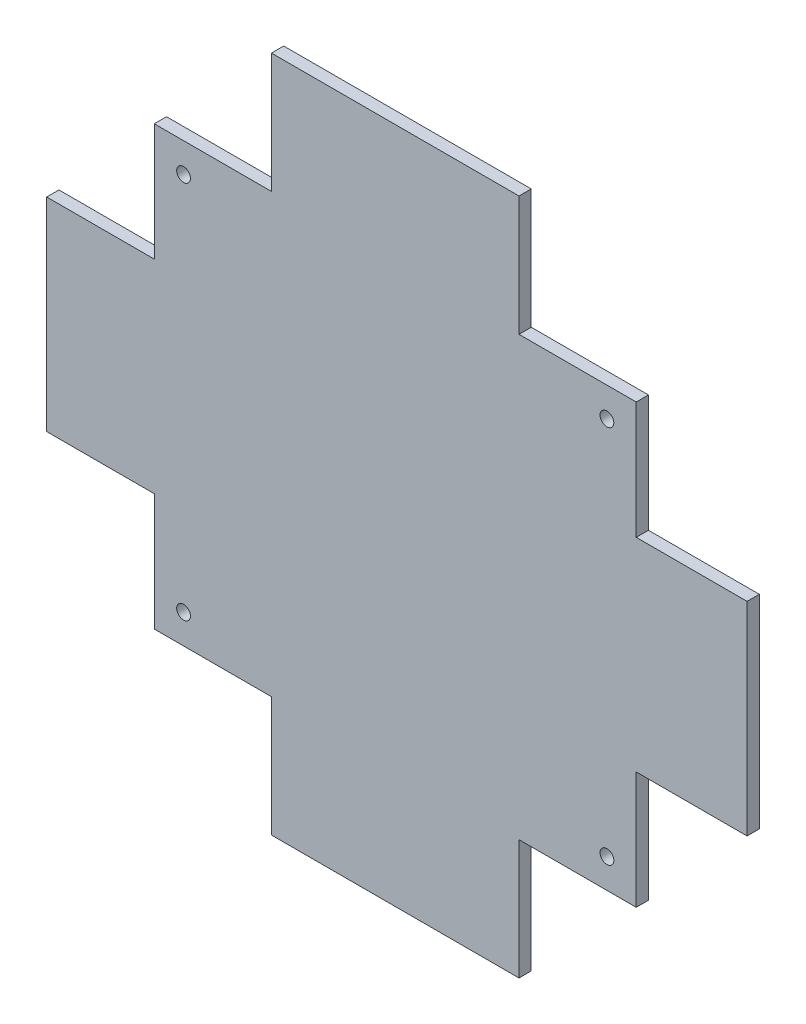
ISO-10303-21;
HEADER;
FILE_DESCRIPTION(('STEP AP214'),'2;1');
FILE_NAME('part.step','',(''),(''),'','','');
FILE_SCHEMA(('AUTOMOTIVE_DESIGN { 1 0 10303 214 1 1 1 1 }'));
ENDSEC;
DATA;
#1=APPLICATION_CONTEXT('core data for automotive mechanical design processes');
#2=APPLICATION_PROTOCOL_DEFINITION('international standard','automotive_design',2000,#1);
#3=PRODUCT_CONTEXT('',#1,'mechanical');
#4=PRODUCT('Part','Part','',(#3));
#5=PRODUCT_RELATED_PRODUCT_CATEGORY('part','',(#4));
#6=PRODUCT_DEFINITION_FORMATION('','',#4);
#7=PRODUCT_DEFINITION_CONTEXT('part definition',#1,'design');
#8=PRODUCT_DEFINITION('design','',#6,#7);
#9=PRODUCT_DEFINITION_SHAPE('','',#8);
#10=(LENGTH_UNIT() NAMED_UNIT(*) SI_UNIT(.MILLI.,.METRE.));
#11=(NAMED_UNIT(*) PLANE_ANGLE_UNIT() SI_UNIT($,.RADIAN.));
#12=(NAMED_UNIT(*) SI_UNIT($,.STERADIAN.) SOLID_ANGLE_UNIT());
#13=UNCERTAINTY_MEASURE_WITH_UNIT(LENGTH_MEASURE(1.E-05),#10,'distance_accuracy_value','');
#14=(GEOMETRIC_REPRESENTATION_CONTEXT(3) GLOBAL_UNCERTAINTY_ASSIGNED_CONTEXT((#13)) GLOBAL_UNIT_ASSIGNED_CONTEXT((#10,
#11,#12)) REPRESENTATION_CONTEXT('',''));
#15=CARTESIAN_POINT('',(0.,0.,0.));
#16=DIRECTION('',(0.,0.,1.));
#17=DIRECTION('',(1.,0.,0.));
#18=AXIS2_PLACEMENT_3D('',#15,#16,#17);
#19=CARTESIAN_POINT('',(55.7999999999952,52.7,6.35));
#20=DIRECTION('',(1.,0.,0.));
#21=DIRECTION('',(0.,1.,0.));
#22=AXIS2_PLACEMENT_3D('',#19,#20,#21);
#23=PLANE('',#22);
#24=DIRECTION('',(0.,-1.,0.));
#25=VECTOR('',#24,1.);
#26=CARTESIAN_POINT('',(55.7999999999952,52.7,0.));
#27=LINE('',#26,#25);
#28=CARTESIAN_POINT('',(55.7999999999952,113.5,0.));
#29=VERTEX_POINT('',#28);
#30=CARTESIAN_POINT('',(55.7999999999952,52.7,0.));
#31=VERTEX_POINT('',#30);
#32=EDGE_CURVE('E193',#29,#31,#27,.T.);
#33=ORIENTED_EDGE('',*,*,#32,.T.);
#34=DIRECTION('',(0.,0.,-1.));
#35=VECTOR('',#34,1.);
#36=CARTESIAN_POINT('',(55.7999999999952,52.7,6.35));
#37=LINE('',#36,#35);
#38=CARTESIAN_POINT('',(55.7999999999952,52.7,6.35));
#39=VERTEX_POINT('',#38);
#40=EDGE_CURVE('E11',#39,#31,#37,.T.);
#41=ORIENTED_EDGE('',*,*,#40,.F.);
#42=DIRECTION('',(0.,-1.,0.));
#43=VECTOR('',#42,1.);
#44=CARTESIAN_POINT('',(55.7999999999952,52.7,6.35));
#45=LINE('',#44,#43);
#46=CARTESIAN_POINT('',(55.7999999999952,113.5,6.35));
#47=VERTEX_POINT('',#46);
#48=EDGE_CURVE('E231',#47,#39,#45,.T.);
#49=ORIENTED_EDGE('',*,*,#48,.F.);
#50=DIRECTION('',(0.,0.,-1.));
#51=VECTOR('',#50,1.);
#52=CARTESIAN_POINT('',(55.7999999999952,113.5,6.35));
#53=LINE('',#52,#51);
#54=EDGE_CURVE('E189',#47,#29,#53,.T.);
#55=ORIENTED_EDGE('',*,*,#54,.T.);
#56=EDGE_LOOP('',(#33,#41,#49,#55));
#57=FACE_BOUND('',#56,.T.);
#58=ADVANCED_FACE('F33',(#57),#23,.F.);
#59=CARTESIAN_POINT('',(0.,52.7,6.35));
#60=DIRECTION('',(0.,-1.,0.));
#61=DIRECTION('',(1.,0.,0.));
#62=AXIS2_PLACEMENT_3D('',#59,#60,#61);
#63=PLANE('',#62);
#64=DIRECTION('',(-1.,0.,0.));
#65=VECTOR('',#64,1.);
#66=CARTESIAN_POINT('',(0.,52.7,0.));
#67=LINE('',#66,#65);
#68=CARTESIAN_POINT('',(0.,52.7,0.));
#69=VERTEX_POINT('',#68);
#70=EDGE_CURVE('E196',#31,#69,#67,.T.);
#71=ORIENTED_EDGE('',*,*,#70,.T.);
#72=DIRECTION('',(0.,0.,-1.));
#73=VECTOR('',#72,1.);
#74=CARTESIAN_POINT('',(0.,52.7,6.35));
#75=LINE('',#74,#73);
#76=CARTESIAN_POINT('',(0.,52.7,6.35));
#77=VERTEX_POINT('',#76);
#78=EDGE_CURVE('E41',#77,#69,#75,.T.);
#79=ORIENTED_EDGE('',*,*,#78,.F.);
#80=DIRECTION('',(-1.,0.,0.));
#81=VECTOR('',#80,1.);
#82=CARTESIAN_POINT('',(0.,52.7,6.35));
#83=LINE('',#82,#81);
#84=EDGE_CURVE('E123',#39,#77,#83,.T.);
#85=ORIENTED_EDGE('',*,*,#84,.F.);
#86=ORIENTED_EDGE('',*,*,#40,.T.);
#87=EDGE_LOOP('',(#71,#79,#85,#86));
#88=FACE_BOUND('',#87,.T.);
#89=ADVANCED_FACE('F344',(#88),#63,.F.);
#90=CARTESIAN_POINT('',(0.,-52.7,6.35));
#91=DIRECTION('',(1.,0.,0.));
#92=DIRECTION('',(0.,0.,-1.));
#93=AXIS2_PLACEMENT_3D('',#90,#91,#92);
#94=PLANE('',#93);
#95=DIRECTION('',(0.,-1.,0.));
#96=VECTOR('',#95,1.);
#97=CARTESIAN_POINT('',(0.,-52.7,0.));
#98=LINE('',#97,#96);
#99=CARTESIAN_POINT('',(0.,-52.7,0.));
#100=VERTEX_POINT('',#99);
#101=EDGE_CURVE('E199',#69,#100,#98,.T.);
#102=ORIENTED_EDGE('',*,*,#101,.T.);
#103=DIRECTION('',(0.,0.,-1.));
#104=VECTOR('',#103,1.);
#105=CARTESIAN_POINT('',(0.,-52.7,6.35));
#106=LINE('',#105,#104);
#107=CARTESIAN_POINT('',(0.,-52.7,6.35));
#108=VERTEX_POINT('',#107);
#109=EDGE_CURVE('E268',#108,#100,#106,.T.);
#110=ORIENTED_EDGE('',*,*,#109,.F.);
#111=DIRECTION('',(0.,-1.,0.));
#112=VECTOR('',#111,1.);
#113=CARTESIAN_POINT('',(0.,-52.7,6.35));
#114=LINE('',#113,#112);
#115=EDGE_CURVE('E276',#77,#108,#114,.T.);
#116=ORIENTED_EDGE('',*,*,#115,.F.);
#117=ORIENTED_EDGE('',*,*,#78,.T.);
#118=EDGE_LOOP('',(#102,#110,#116,#117));
#119=FACE_BOUND('',#118,.T.);
#120=ADVANCED_FACE('F274',(#119),#94,.F.);
#121=CARTESIAN_POINT('',(55.7999999999952,-52.7,6.35));
#122=DIRECTION('',(0.,1.,0.));
#123=DIRECTION('',(-1.,0.,0.));
#124=AXIS2_PLACEMENT_3D('',#121,#122,#123);
#125=PLANE('',#124);
#126=DIRECTION('',(1.,0.,0.));
#127=VECTOR('',#126,1.);
#128=CARTESIAN_POINT('',(55.7999999999952,-52.7,0.));
#129=LINE('',#128,#127);
#130=CARTESIAN_POINT('',(55.7999999999952,-52.7,0.));
#131=VERTEX_POINT('',#130);
#132=EDGE_CURVE('E201',#100,#131,#129,.T.);
#133=ORIENTED_EDGE('',*,*,#132,.T.);
#134=DIRECTION('',(0.,0.,-1.));
#135=VECTOR('',#134,1.);
#136=CARTESIAN_POINT('',(55.7999999999952,-52.7,6.35));
#137=LINE('',#136,#135);
#138=CARTESIAN_POINT('',(55.7999999999952,-52.7,6.35));
#139=VERTEX_POINT('',#138);
#140=EDGE_CURVE('E265',#139,#131,#137,.T.);
#141=ORIENTED_EDGE('',*,*,#140,.F.);
#142=DIRECTION('',(1.,0.,0.));
#143=VECTOR('',#142,1.);
#144=CARTESIAN_POINT('',(55.7999999999952,-52.7,6.35));
#145=LINE('',#144,#143);
#146=EDGE_CURVE('E294',#108,#139,#145,.T.);
#147=ORIENTED_EDGE('',*,*,#146,.F.);
#148=ORIENTED_EDGE('',*,*,#109,.T.);
#149=EDGE_LOOP('',(#133,#141,#147,#148));
#150=FACE_BOUND('',#149,.T.);
#151=ADVANCED_FACE('F285',(#150),#125,.F.);
#152=CARTESIAN_POINT('',(55.7999999999952,-113.5,6.35));
#153=DIRECTION('',(1.,0.,0.));
#154=DIRECTION('',(0.,0.,-1.));
#155=AXIS2_PLACEMENT_3D('',#152,#153,#154);
#156=PLANE('',#155);
#157=DIRECTION('',(0.,-1.,0.));
#158=VECTOR('',#157,1.);
#159=CARTESIAN_POINT('',(55.7999999999952,-113.5,0.));
#160=LINE('',#159,#158);
#161=CARTESIAN_POINT('',(55.7999999999952,-113.5,0.));
#162=VERTEX_POINT('',#161);
#163=EDGE_CURVE('E203',#131,#162,#160,.T.);
#164=ORIENTED_EDGE('',*,*,#163,.T.);
#165=DIRECTION('',(0.,0.,-1.));
#166=VECTOR('',#165,1.);
#167=CARTESIAN_POINT('',(55.7999999999952,-113.5,6.35));
#168=LINE('',#167,#166);
#169=CARTESIAN_POINT('',(55.7999999999952,-113.5,6.35));
#170=VERTEX_POINT('',#169);
#171=EDGE_CURVE('E262',#170,#162,#168,.T.);
#172=ORIENTED_EDGE('',*,*,#171,.F.);
#173=DIRECTION('',(0.,-1.,0.));
#174=VECTOR('',#173,1.);
#175=CARTESIAN_POINT('',(55.7999999999952,-113.5,6.35));
#176=LINE('',#175,#174);
#177=EDGE_CURVE('E291',#139,#170,#176,.T.);
#178=ORIENTED_EDGE('',*,*,#177,.F.);
#179=ORIENTED_EDGE('',*,*,#140,.T.);
#180=EDGE_LOOP('',(#164,#172,#178,#179));
#181=FACE_BOUND('',#180,.T.);
#182=ADVANCED_FACE('F289',(#181),#156,.F.);
#183=CARTESIAN_POINT('',(116.599999999995,-113.5,6.35));
#184=DIRECTION('',(0.,1.,0.));
#185=DIRECTION('',(-1.,0.,0.));
#186=AXIS2_PLACEMENT_3D('',#183,#184,#185);
#187=PLANE('',#186);
#188=DIRECTION('',(1.,0.,0.));
#189=VECTOR('',#188,1.);
#190=CARTESIAN_POINT('',(116.599999999995,-113.5,0.));
#191=LINE('',#190,#189);
#192=CARTESIAN_POINT('',(116.599999999995,-113.5,0.));
#193=VERTEX_POINT('',#192);
#194=EDGE_CURVE('E205',#162,#193,#191,.T.);
#195=ORIENTED_EDGE('',*,*,#194,.T.);
#196=DIRECTION('',(0.,0.,-1.));
#197=VECTOR('',#196,1.);
#198=CARTESIAN_POINT('',(116.599999999995,-113.5,6.35));
#199=LINE('',#198,#197);
#200=CARTESIAN_POINT('',(116.599999999995,-113.5,6.35));
#201=VERTEX_POINT('',#200);
#202=EDGE_CURVE('E259',#201,#193,#199,.T.);
#203=ORIENTED_EDGE('',*,*,#202,.F.);
#204=DIRECTION('',(1.,0.,0.));
#205=VECTOR('',#204,1.);
#206=CARTESIAN_POINT('',(116.599999999995,-113.5,6.35));
#207=LINE('',#206,#205);
#208=EDGE_CURVE('E293',#170,#201,#207,.T.);
#209=ORIENTED_EDGE('',*,*,#208,.F.);
#210=ORIENTED_EDGE('',*,*,#171,.T.);
#211=EDGE_LOOP('',(#195,#203,#209,#210));
#212=FACE_BOUND('',#211,.T.);
#213=ADVANCED_FACE('F357',(#212),#187,.F.);
#214=CARTESIAN_POINT('',(116.599999999995,-175.649999999999,6.35));
#215=DIRECTION('',(1.,0.,0.));
#216=DIRECTION('',(0.,1.,0.));
#217=AXIS2_PLACEMENT_3D('',#214,#215,#216);
#218=PLANE('',#217);
#219=DIRECTION('',(0.,-1.,0.));
#220=VECTOR('',#219,1.);
#221=CARTESIAN_POINT('',(116.599999999995,-175.649999999999,0.));
#222=LINE('',#221,#220);
#223=CARTESIAN_POINT('',(116.599999999995,-175.649999999999,0.));
#224=VERTEX_POINT('',#223);
#225=EDGE_CURVE('E207',#193,#224,#222,.T.);
#226=ORIENTED_EDGE('',*,*,#225,.T.);
#227=DIRECTION('',(0.,0.,-1.));
#228=VECTOR('',#227,1.);
#229=CARTESIAN_POINT('',(116.599999999995,-175.649999999999,6.35));
#230=LINE('',#229,#228);
#231=CARTESIAN_POINT('',(116.599999999995,-175.649999999999,6.35));
#232=VERTEX_POINT('',#231);
#233=EDGE_CURVE('E256',#232,#224,#230,.T.);
#234=ORIENTED_EDGE('',*,*,#233,.F.);
#235=DIRECTION('',(0.,-1.,0.));
#236=VECTOR('',#235,1.);
#237=CARTESIAN_POINT('',(116.599999999995,-175.649999999999,6.35));
#238=LINE('',#237,#236);
#239=EDGE_CURVE('E296',#201,#232,#238,.T.);
#240=ORIENTED_EDGE('',*,*,#239,.F.);
#241=ORIENTED_EDGE('',*,*,#202,.T.);
#242=EDGE_LOOP('',(#226,#234,#240,#241));
#243=FACE_BOUND('',#242,.T.);
#244=ADVANCED_FACE('F360',(#243),#218,.F.);
#245=CARTESIAN_POINT('',(244.999999999997,-175.649999999999,6.35));
#246=DIRECTION('',(0.,1.,0.));
#247=DIRECTION('',(0.,0.,1.));
#248=AXIS2_PLACEMENT_3D('',#245,#246,#247);
#249=PLANE('',#248);
#250=DIRECTION('',(1.,0.,0.));
#251=VECTOR('',#250,1.);
#252=CARTESIAN_POINT('',(244.999999999997,-175.649999999999,0.));
#253=LINE('',#252,#251);
#254=CARTESIAN_POINT('',(244.999999999997,-175.649999999999,0.));
#255=VERTEX_POINT('',#254);
#256=EDGE_CURVE('E209',#224,#255,#253,.T.);
#257=ORIENTED_EDGE('',*,*,#256,.T.);
#258=DIRECTION('',(0.,0.,-1.));
#259=VECTOR('',#258,1.);
#260=CARTESIAN_POINT('',(244.999999999997,-175.649999999999,6.35));
#261=LINE('',#260,#259);
#262=CARTESIAN_POINT('',(244.999999999997,-175.649999999999,6.35));
#263=VERTEX_POINT('',#262);
#264=EDGE_CURVE('E253',#263,#255,#261,.T.);
#265=ORIENTED_EDGE('',*,*,#264,.F.);
#266=DIRECTION('',(1.,0.,0.));
#267=VECTOR('',#266,1.);
#268=CARTESIAN_POINT('',(244.999999999997,-175.649999999999,6.35));
#269=LINE('',#268,#267);
#270=EDGE_CURVE('E302',#232,#263,#269,.T.);
#271=ORIENTED_EDGE('',*,*,#270,.F.);
#272=ORIENTED_EDGE('',*,*,#233,.T.);
#273=EDGE_LOOP('',(#257,#265,#271,#272));
#274=FACE_BOUND('',#273,.T.);
#275=ADVANCED_FACE('F364',(#274),#249,.F.);
#276=CARTESIAN_POINT('',(244.999999999997,-113.5,6.35));
#277=DIRECTION('',(-1.,0.,0.));
#278=DIRECTION('',(0.,0.,1.));
#279=AXIS2_PLACEMENT_3D('',#276,#277,#278);
#280=PLANE('',#279);
#281=DIRECTION('',(0.,1.,0.));
#282=VECTOR('',#281,1.);
#283=CARTESIAN_POINT('',(244.999999999997,-113.5,0.));
#284=LINE('',#283,#282);
#285=CARTESIAN_POINT('',(244.999999999997,-113.5,0.));
#286=VERTEX_POINT('',#285);
#287=EDGE_CURVE('E211',#255,#286,#284,.T.);
#288=ORIENTED_EDGE('',*,*,#287,.T.);
#289=DIRECTION('',(0.,0.,-1.));
#290=VECTOR('',#289,1.);
#291=CARTESIAN_POINT('',(244.999999999997,-113.5,6.35));
#292=LINE('',#291,#290);
#293=CARTESIAN_POINT('',(244.999999999997,-113.5,6.35));
#294=VERTEX_POINT('',#293);
#295=EDGE_CURVE('E250',#294,#286,#292,.T.);
#296=ORIENTED_EDGE('',*,*,#295,.F.);
#297=DIRECTION('',(0.,1.,0.));
#298=VECTOR('',#297,1.);
#299=CARTESIAN_POINT('',(244.999999999997,-113.5,6.35));
#300=LINE('',#299,#298);
#301=EDGE_CURVE('E304',#263,#294,#300,.T.);
#302=ORIENTED_EDGE('',*,*,#301,.F.);
#303=ORIENTED_EDGE('',*,*,#264,.T.);
#304=EDGE_LOOP('',(#288,#296,#302,#303));
#305=FACE_BOUND('',#304,.T.);
#306=ADVANCED_FACE('F368',(#305),#280,.F.);
#307=CARTESIAN_POINT('',(305.799999999994,-113.5,6.35));
#308=DIRECTION('',(0.,1.,0.));
#309=DIRECTION('',(-1.,0.,0.));
#310=AXIS2_PLACEMENT_3D('',#307,#308,#309);
#311=PLANE('',#310);
#312=DIRECTION('',(1.,0.,0.));
#313=VECTOR('',#312,1.);
#314=CARTESIAN_POINT('',(305.799999999994,-113.5,0.));
#315=LINE('',#314,#313);
#316=CARTESIAN_POINT('',(305.799999999994,-113.5,0.));
#317=VERTEX_POINT('',#316);
#318=EDGE_CURVE('E213',#286,#317,#315,.T.);
#319=ORIENTED_EDGE('',*,*,#318,.T.);
#320=DIRECTION('',(0.,0.,-1.));
#321=VECTOR('',#320,1.);
#322=CARTESIAN_POINT('',(305.799999999994,-113.5,6.35));
#323=LINE('',#322,#321);
#324=CARTESIAN_POINT('',(305.799999999994,-113.5,6.35));
#325=VERTEX_POINT('',#324);
#326=EDGE_CURVE('E247',#325,#317,#323,.T.);
#327=ORIENTED_EDGE('',*,*,#326,.F.);
#328=DIRECTION('',(1.,0.,0.));
#329=VECTOR('',#328,1.);
#330=CARTESIAN_POINT('',(305.799999999994,-113.5,6.35));
#331=LINE('',#330,#329);
#332=EDGE_CURVE('E306',#294,#325,#331,.T.);
#333=ORIENTED_EDGE('',*,*,#332,.F.);
#334=ORIENTED_EDGE('',*,*,#295,.T.);
#335=EDGE_LOOP('',(#319,#327,#333,#334));
#336=FACE_BOUND('',#335,.T.);
#337=ADVANCED_FACE('F372',(#336),#311,.F.);
#338=CARTESIAN_POINT('',(305.799999999994,-52.6999999999999,6.35));
#339=DIRECTION('',(-1.,0.,0.));
#340=DIRECTION('',(0.,0.,1.));
#341=AXIS2_PLACEMENT_3D('',#338,#339,#340);
#342=PLANE('',#341);
#343=DIRECTION('',(0.,1.,0.));
#344=VECTOR('',#343,1.);
#345=CARTESIAN_POINT('',(305.799999999994,-52.6999999999999,0.));
#346=LINE('',#345,#344);
#347=CARTESIAN_POINT('',(305.799999999994,-52.6999999999999,0.));
#348=VERTEX_POINT('',#347);
#349=EDGE_CURVE('E215',#317,#348,#346,.T.);
#350=ORIENTED_EDGE('',*,*,#349,.T.);
#351=DIRECTION('',(0.,0.,-1.));
#352=VECTOR('',#351,1.);
#353=CARTESIAN_POINT('',(305.799999999994,-52.6999999999999,6.35));
#354=LINE('',#353,#352);
#355=CARTESIAN_POINT('',(305.799999999994,-52.6999999999999,6.35));
#356=VERTEX_POINT('',#355);
#357=EDGE_CURVE('E244',#356,#348,#354,.T.);
#358=ORIENTED_EDGE('',*,*,#357,.F.);
#359=DIRECTION('',(0.,1.,0.));
#360=VECTOR('',#359,1.);
#361=CARTESIAN_POINT('',(305.799999999994,-52.6999999999999,6.35));
#362=LINE('',#361,#360);
#363=EDGE_CURVE('E308',#325,#356,#362,.T.);
#364=ORIENTED_EDGE('',*,*,#363,.F.);
#365=ORIENTED_EDGE('',*,*,#326,.T.);
#366=EDGE_LOOP('',(#350,#358,#364,#365));
#367=FACE_BOUND('',#366,.T.);
#368=ADVANCED_FACE('F376',(#367),#342,.F.);
#369=CARTESIAN_POINT('',(362.099999999994,-52.6999999999999,6.35));
#370=DIRECTION('',(0.,1.,0.));
#371=DIRECTION('',(-1.,0.,0.));
#372=AXIS2_PLACEMENT_3D('',#369,#370,#371);
#373=PLANE('',#372);
#374=DIRECTION('',(1.,0.,0.));
#375=VECTOR('',#374,1.);
#376=CARTESIAN_POINT('',(362.099999999994,-52.6999999999999,0.));
#377=LINE('',#376,#375);
#378=CARTESIAN_POINT('',(363.299999999994,-52.7000000000001,0.));
#379=VERTEX_POINT('',#378);
#380=EDGE_CURVE('E217',#348,#379,#377,.T.);
#381=ORIENTED_EDGE('',*,*,#380,.T.);
#382=DIRECTION('',(0.,0.,1.));
#383=VECTOR('',#382,1.);
#384=CARTESIAN_POINT('',(363.299999999994,-52.7000000000001,0.));
#385=LINE('',#384,#383);
#386=CARTESIAN_POINT('',(363.299999999994,-52.7000000000001,6.35));
#387=VERTEX_POINT('',#386);
#388=EDGE_CURVE('E521',#379,#387,#385,.T.);
#389=ORIENTED_EDGE('',*,*,#388,.T.);
#390=DIRECTION('',(1.,0.,0.));
#391=VECTOR('',#390,1.);
#392=CARTESIAN_POINT('',(362.099999999994,-52.6999999999999,6.35));
#393=LINE('',#392,#391);
#394=EDGE_CURVE('E310',#356,#387,#393,.T.);
#395=ORIENTED_EDGE('',*,*,#394,.F.);
#396=ORIENTED_EDGE('',*,*,#357,.T.);
#397=EDGE_LOOP('',(#381,#389,#395,#396));
#398=FACE_BOUND('',#397,.T.);
#399=ADVANCED_FACE('F380',(#398),#373,.F.);
#400=CARTESIAN_POINT('',(305.799999999994,52.7,6.35));
#401=DIRECTION('',(0.,-1.,0.));
#402=DIRECTION('',(0.,0.,-1.));
#403=AXIS2_PLACEMENT_3D('',#400,#401,#402);
#404=PLANE('',#403);
#405=DIRECTION('',(-1.,0.,0.));
#406=VECTOR('',#405,1.);
#407=CARTESIAN_POINT('',(305.799999999994,52.7,0.));
#408=LINE('',#407,#406);
#409=CARTESIAN_POINT('',(363.299999999994,52.7,0.));
#410=VERTEX_POINT('',#409);
#411=CARTESIAN_POINT('',(305.799999999994,52.7,0.));
#412=VERTEX_POINT('',#411);
#413=EDGE_CURVE('E220',#410,#412,#408,.T.);
#414=ORIENTED_EDGE('',*,*,#413,.T.);
#415=DIRECTION('',(0.,0.,-1.));
#416=VECTOR('',#415,1.);
#417=CARTESIAN_POINT('',(305.799999999994,52.7,6.35));
#418=LINE('',#417,#416);
#419=CARTESIAN_POINT('',(305.799999999994,52.7,6.35));
#420=VERTEX_POINT('',#419);
#421=EDGE_CURVE('E241',#420,#412,#418,.T.);
#422=ORIENTED_EDGE('',*,*,#421,.F.);
#423=DIRECTION('',(-1.,0.,0.));
#424=VECTOR('',#423,1.);
#425=CARTESIAN_POINT('',(305.799999999994,52.7,6.35));
#426=LINE('',#425,#424);
#427=CARTESIAN_POINT('',(363.299999999994,52.7,6.35));
#428=VERTEX_POINT('',#427);
#429=EDGE_CURVE('E313',#428,#420,#426,.T.);
#430=ORIENTED_EDGE('',*,*,#429,.F.);
#431=DIRECTION('',(0.,0.,1.));
#432=VECTOR('',#431,1.);
#433=CARTESIAN_POINT('',(363.299999999994,52.7,0.));
#434=LINE('',#433,#432);
#435=EDGE_CURVE('E197',#410,#428,#434,.T.);
#436=ORIENTED_EDGE('',*,*,#435,.F.);
#437=EDGE_LOOP('',(#414,#422,#430,#436));
#438=FACE_BOUND('',#437,.T.);
#439=ADVANCED_FACE('F383',(#438),#404,.F.);
#440=CARTESIAN_POINT('',(305.799999999994,113.5,6.35));
#441=DIRECTION('',(-1.,0.,0.));
#442=DIRECTION('',(0.,-1.,0.));
#443=AXIS2_PLACEMENT_3D('',#440,#441,#442);
#444=PLANE('',#443);
#445=DIRECTION('',(0.,1.,0.));
#446=VECTOR('',#445,1.);
#447=CARTESIAN_POINT('',(305.799999999994,113.5,0.));
#448=LINE('',#447,#446);
#449=CARTESIAN_POINT('',(305.799999999994,113.5,0.));
#450=VERTEX_POINT('',#449);
#451=EDGE_CURVE('E222',#412,#450,#448,.T.);
#452=ORIENTED_EDGE('',*,*,#451,.T.);
#453=DIRECTION('',(0.,0.,-1.));
#454=VECTOR('',#453,1.);
#455=CARTESIAN_POINT('',(305.799999999994,113.5,6.35));
#456=LINE('',#455,#454);
#457=CARTESIAN_POINT('',(305.799999999994,113.5,6.35));
#458=VERTEX_POINT('',#457);
#459=EDGE_CURVE('E238',#458,#450,#456,.T.);
#460=ORIENTED_EDGE('',*,*,#459,.F.);
#461=DIRECTION('',(0.,1.,0.));
#462=VECTOR('',#461,1.);
#463=CARTESIAN_POINT('',(305.799999999994,113.5,6.35));
#464=LINE('',#463,#462);
#465=EDGE_CURVE('E315',#420,#458,#464,.T.);
#466=ORIENTED_EDGE('',*,*,#465,.F.);
#467=ORIENTED_EDGE('',*,*,#421,.T.);
#468=EDGE_LOOP('',(#452,#460,#466,#467));
#469=FACE_BOUND('',#468,.T.);
#470=ADVANCED_FACE('F387',(#469),#444,.F.);
#471=CARTESIAN_POINT('',(244.999999999994,113.5,6.35));
#472=DIRECTION('',(0.,-1.,0.));
#473=DIRECTION('',(0.,0.,-1.));
#474=AXIS2_PLACEMENT_3D('',#471,#472,#473);
#475=PLANE('',#474);
#476=DIRECTION('',(-1.,0.,0.));
#477=VECTOR('',#476,1.);
#478=CARTESIAN_POINT('',(244.999999999994,113.5,0.));
#479=LINE('',#478,#477);
#480=CARTESIAN_POINT('',(244.999999999994,113.5,0.));
#481=VERTEX_POINT('',#480);
#482=EDGE_CURVE('E224',#450,#481,#479,.T.);
#483=ORIENTED_EDGE('',*,*,#482,.T.);
#484=DIRECTION('',(0.,0.,-1.));
#485=VECTOR('',#484,1.);
#486=CARTESIAN_POINT('',(244.999999999994,113.5,6.35));
#487=LINE('',#486,#485);
#488=CARTESIAN_POINT('',(244.999999999994,113.5,6.35));
#489=VERTEX_POINT('',#488);
#490=EDGE_CURVE('E235',#489,#481,#487,.T.);
#491=ORIENTED_EDGE('',*,*,#490,.F.);
#492=DIRECTION('',(-1.,0.,0.));
#493=VECTOR('',#492,1.);
#494=CARTESIAN_POINT('',(244.999999999994,113.5,6.35));
#495=LINE('',#494,#493);
#496=EDGE_CURVE('E317',#458,#489,#495,.T.);
#497=ORIENTED_EDGE('',*,*,#496,.F.);
#498=ORIENTED_EDGE('',*,*,#459,.T.);
#499=EDGE_LOOP('',(#483,#491,#497,#498));
#500=FACE_BOUND('',#499,.T.);
#501=ADVANCED_FACE('F323',(#500),#475,.F.);
#502=CARTESIAN_POINT('',(244.999999999994,175.65,6.35));
#503=DIRECTION('',(-1.,0.,0.));
#504=DIRECTION('',(0.,-1.,0.));
#505=AXIS2_PLACEMENT_3D('',#502,#503,#504);
#506=PLANE('',#505);
#507=DIRECTION('',(0.,1.,0.));
#508=VECTOR('',#507,1.);
#509=CARTESIAN_POINT('',(244.999999999994,175.65,0.));
#510=LINE('',#509,#508);
#511=CARTESIAN_POINT('',(244.999999999994,175.65,0.));
#512=VERTEX_POINT('',#511);
#513=EDGE_CURVE('E226',#481,#512,#510,.T.);
#514=ORIENTED_EDGE('',*,*,#513,.T.);
#515=DIRECTION('',(0.,0.,-1.));
#516=VECTOR('',#515,1.);
#517=CARTESIAN_POINT('',(244.999999999994,175.65,6.35));
#518=LINE('',#517,#516);
#519=CARTESIAN_POINT('',(244.999999999994,175.65,6.35));
#520=VERTEX_POINT('',#519);
#521=EDGE_CURVE('E184',#520,#512,#518,.T.);
#522=ORIENTED_EDGE('',*,*,#521,.F.);
#523=DIRECTION('',(0.,1.,0.));
#524=VECTOR('',#523,1.);
#525=CARTESIAN_POINT('',(244.999999999994,175.65,6.35));
#526=LINE('',#525,#524);
#527=EDGE_CURVE('E175',#489,#520,#526,.T.);
#528=ORIENTED_EDGE('',*,*,#527,.F.);
#529=ORIENTED_EDGE('',*,*,#490,.T.);
#530=EDGE_LOOP('',(#514,#522,#528,#529));
#531=FACE_BOUND('',#530,.T.);
#532=ADVANCED_FACE('F327',(#531),#506,.F.);
#533=CARTESIAN_POINT('',(116.599999999995,175.65,6.35));
#534=DIRECTION('',(0.,-1.,0.));
#535=DIRECTION('',(0.,0.,-1.));
#536=AXIS2_PLACEMENT_3D('',#533,#534,#535);
#537=PLANE('',#536);
#538=DIRECTION('',(-1.,0.,0.));
#539=VECTOR('',#538,1.);
#540=CARTESIAN_POINT('',(116.599999999995,175.65,0.));
#541=LINE('',#540,#539);
#542=CARTESIAN_POINT('',(116.599999999995,175.65,0.));
#543=VERTEX_POINT('',#542);
#544=EDGE_CURVE('E183',#512,#543,#541,.T.);
#545=ORIENTED_EDGE('',*,*,#544,.T.);
#546=DIRECTION('',(0.,0.,-1.));
#547=VECTOR('',#546,1.);
#548=CARTESIAN_POINT('',(116.599999999995,175.65,6.35));
#549=LINE('',#548,#547);
#550=CARTESIAN_POINT('',(116.599999999995,175.65,6.35));
#551=VERTEX_POINT('',#550);
#552=EDGE_CURVE('E180',#551,#543,#549,.T.);
#553=ORIENTED_EDGE('',*,*,#552,.F.);
#554=DIRECTION('',(-1.,0.,0.));
#555=VECTOR('',#554,1.);
#556=CARTESIAN_POINT('',(116.599999999995,175.65,6.35));
#557=LINE('',#556,#555);
#558=EDGE_CURVE('E169',#520,#551,#557,.T.);
#559=ORIENTED_EDGE('',*,*,#558,.F.);
#560=ORIENTED_EDGE('',*,*,#521,.T.);
#561=EDGE_LOOP('',(#545,#553,#559,#560));
#562=FACE_BOUND('',#561,.T.);
#563=ADVANCED_FACE('F181',(#562),#537,.F.);
#564=CARTESIAN_POINT('',(116.599999999995,113.5,6.35));
#565=DIRECTION('',(1.,0.,0.));
#566=DIRECTION('',(0.,0.,-1.));
#567=AXIS2_PLACEMENT_3D('',#564,#565,#566);
#568=PLANE('',#567);
#569=DIRECTION('',(0.,-1.,0.));
#570=VECTOR('',#569,1.);
#571=CARTESIAN_POINT('',(116.599999999995,113.5,0.));
#572=LINE('',#571,#570);
#573=CARTESIAN_POINT('',(116.599999999995,113.5,0.));
#574=VERTEX_POINT('',#573);
#575=EDGE_CURVE('E109',#543,#574,#572,.T.);
#576=ORIENTED_EDGE('',*,*,#575,.T.);
#577=DIRECTION('',(0.,0.,-1.));
#578=VECTOR('',#577,1.);
#579=CARTESIAN_POINT('',(116.599999999995,113.5,6.35));
#580=LINE('',#579,#578);
#581=CARTESIAN_POINT('',(116.599999999995,113.5,6.35));
#582=VERTEX_POINT('',#581);
#583=EDGE_CURVE('E185',#582,#574,#580,.T.);
#584=ORIENTED_EDGE('',*,*,#583,.F.);
#585=DIRECTION('',(0.,-1.,0.));
#586=VECTOR('',#585,1.);
#587=CARTESIAN_POINT('',(116.599999999995,113.5,6.35));
#588=LINE('',#587,#586);
#589=EDGE_CURVE('E173',#551,#582,#588,.T.);
#590=ORIENTED_EDGE('',*,*,#589,.F.);
#591=ORIENTED_EDGE('',*,*,#552,.T.);
#592=EDGE_LOOP('',(#576,#584,#590,#591));
#593=FACE_BOUND('',#592,.T.);
#594=ADVANCED_FACE('F187',(#593),#568,.F.);
#595=CARTESIAN_POINT('',(55.7999999999952,113.5,6.35));
#596=DIRECTION('',(0.,-1.,0.));
#597=DIRECTION('',(0.,0.,-1.));
#598=AXIS2_PLACEMENT_3D('',#595,#596,#597);
#599=PLANE('',#598);
#600=DIRECTION('',(-1.,0.,0.));
#601=VECTOR('',#600,1.);
#602=CARTESIAN_POINT('',(55.7999999999952,113.5,0.));
#603=LINE('',#602,#601);
#604=EDGE_CURVE('E115',#574,#29,#603,.T.);
#605=ORIENTED_EDGE('',*,*,#604,.T.);
#606=ORIENTED_EDGE('',*,*,#54,.F.);
#607=DIRECTION('',(-1.,0.,0.));
#608=VECTOR('',#607,1.);
#609=CARTESIAN_POINT('',(55.7999999999952,113.5,6.35));
#610=LINE('',#609,#608);
#611=EDGE_CURVE('E49',#582,#47,#610,.T.);
#612=ORIENTED_EDGE('',*,*,#611,.F.);
#613=ORIENTED_EDGE('',*,*,#583,.T.);
#614=EDGE_LOOP('',(#605,#606,#612,#613));
#615=FACE_BOUND('',#614,.T.);
#616=ADVANCED_FACE('F331',(#615),#599,.F.);
#617=CARTESIAN_POINT('',(0.,0.,6.35));
#618=DIRECTION('',(0.,0.,-1.));
#619=DIRECTION('',(-1.,0.,0.));
#620=AXIS2_PLACEMENT_3D('',#617,#618,#619);
#621=PLANE('',#620);
#622=CARTESIAN_POINT('',(290.599999999992,98.3,6.35));
#623=DIRECTION('',(0.,0.,-1.));
#624=DIRECTION('',(-1.,0.,0.));
#625=AXIS2_PLACEMENT_3D('',#622,#623,#624);
#626=CIRCLE('',#625,3.57123999999998);
#627=CARTESIAN_POINT('',(287.028759999992,98.3,6.35));
#628=VERTEX_POINT('',#627);
#629=EDGE_CURVE('E492',#628,#628,#626,.T.);
#630=ORIENTED_EDGE('',*,*,#629,.T.);
#631=EDGE_LOOP('',(#630));
#632=FACE_BOUND('',#631,.T.);
#633=CARTESIAN_POINT('',(70.9999999999938,98.3,6.35));
#634=DIRECTION('',(0.,0.,-1.));
#635=DIRECTION('',(-1.,0.,0.));
#636=AXIS2_PLACEMENT_3D('',#633,#634,#635);
#637=CIRCLE('',#636,3.57124);
#638=CARTESIAN_POINT('',(67.4287599999938,98.3,6.35));
#639=VERTEX_POINT('',#638);
#640=EDGE_CURVE('E502',#639,#639,#637,.T.);
#641=ORIENTED_EDGE('',*,*,#640,.T.);
#642=EDGE_LOOP('',(#641));
#643=FACE_BOUND('',#642,.T.);
#644=CARTESIAN_POINT('',(70.9999999999938,-98.3,6.35));
#645=DIRECTION('',(0.,0.,-1.));
#646=DIRECTION('',(-1.,0.,0.));
#647=AXIS2_PLACEMENT_3D('',#644,#645,#646);
#648=CIRCLE('',#647,3.57124);
#649=CARTESIAN_POINT('',(67.4287599999938,-98.3,6.35));
#650=VERTEX_POINT('',#649);
#651=EDGE_CURVE('E508',#650,#650,#648,.T.);
#652=ORIENTED_EDGE('',*,*,#651,.T.);
#653=EDGE_LOOP('',(#652));
#654=FACE_BOUND('',#653,.T.);
#655=CARTESIAN_POINT('',(290.599999999995,-98.3,6.35));
#656=DIRECTION('',(0.,0.,-1.));
#657=DIRECTION('',(-1.,0.,0.));
#658=AXIS2_PLACEMENT_3D('',#655,#656,#657);
#659=CIRCLE('',#658,3.57123999999998);
#660=CARTESIAN_POINT('',(287.028759999995,-98.3,6.35));
#661=VERTEX_POINT('',#660);
#662=EDGE_CURVE('E514',#661,#661,#659,.T.);
#663=ORIENTED_EDGE('',*,*,#662,.T.);
#664=EDGE_LOOP('',(#663));
#665=FACE_BOUND('',#664,.T.);
#666=ORIENTED_EDGE('',*,*,#48,.T.);
#667=ORIENTED_EDGE('',*,*,#84,.T.);
#668=ORIENTED_EDGE('',*,*,#115,.T.);
#669=ORIENTED_EDGE('',*,*,#146,.T.);
#670=ORIENTED_EDGE('',*,*,#177,.T.);
#671=ORIENTED_EDGE('',*,*,#208,.T.);
#672=ORIENTED_EDGE('',*,*,#239,.T.);
#673=ORIENTED_EDGE('',*,*,#270,.T.);
#674=ORIENTED_EDGE('',*,*,#301,.T.);
#675=ORIENTED_EDGE('',*,*,#332,.T.);
#676=ORIENTED_EDGE('',*,*,#363,.T.);
#677=ORIENTED_EDGE('',*,*,#394,.T.);
#678=DIRECTION('',(0.,1.,0.));
#679=VECTOR('',#678,1.);
#680=CARTESIAN_POINT('',(363.299999999994,52.7,6.35));
#681=LINE('',#680,#679);
#682=EDGE_CURVE('E517',#387,#428,#681,.T.);
#683=ORIENTED_EDGE('',*,*,#682,.T.);
#684=ORIENTED_EDGE('',*,*,#429,.T.);
#685=ORIENTED_EDGE('',*,*,#465,.T.);
#686=ORIENTED_EDGE('',*,*,#496,.T.);
#687=ORIENTED_EDGE('',*,*,#527,.T.);
#688=ORIENTED_EDGE('',*,*,#558,.T.);
#689=ORIENTED_EDGE('',*,*,#589,.T.);
#690=ORIENTED_EDGE('',*,*,#611,.T.);
#691=EDGE_LOOP('',(#666,#667,#668,#669,#670,#671,#672,#673,#674,#675,#676,#677,#683,#684,#685,
#686,#687,#688,#689,#690));
#692=FACE_BOUND('',#691,.T.);
#693=ADVANCED_FACE('F171',(#632,#643,#654,#665,#692),#621,.F.);
#694=CARTESIAN_POINT('',(0.,0.,0.));
#695=DIRECTION('',(0.,0.,-1.));
#696=DIRECTION('',(-1.,0.,0.));
#697=AXIS2_PLACEMENT_3D('',#694,#695,#696);
#698=PLANE('',#697);
#699=CARTESIAN_POINT('',(290.599999999992,98.3,0.));
#700=DIRECTION('',(0.,0.,-1.));
#701=DIRECTION('',(-1.,0.,0.));
#702=AXIS2_PLACEMENT_3D('',#699,#700,#701);
#703=CIRCLE('',#702,3.57123999999998);
#704=CARTESIAN_POINT('',(287.028759999992,98.3,0.));
#705=VERTEX_POINT('',#704);
#706=EDGE_CURVE('E495',#705,#705,#703,.T.);
#707=ORIENTED_EDGE('',*,*,#706,.F.);
#708=EDGE_LOOP('',(#707));
#709=FACE_BOUND('',#708,.T.);
#710=CARTESIAN_POINT('',(70.9999999999938,98.3,0.));
#711=DIRECTION('',(0.,0.,-1.));
#712=DIRECTION('',(-1.,0.,0.));
#713=AXIS2_PLACEMENT_3D('',#710,#711,#712);
#714=CIRCLE('',#713,3.57124);
#715=CARTESIAN_POINT('',(67.4287599999938,98.3,0.));
#716=VERTEX_POINT('',#715);
#717=EDGE_CURVE('E497',#716,#716,#714,.T.);
#718=ORIENTED_EDGE('',*,*,#717,.F.);
#719=EDGE_LOOP('',(#718));
#720=FACE_BOUND('',#719,.T.);
#721=CARTESIAN_POINT('',(70.9999999999938,-98.3,0.));
#722=DIRECTION('',(0.,0.,-1.));
#723=DIRECTION('',(-1.,0.,0.));
#724=AXIS2_PLACEMENT_3D('',#721,#722,#723);
#725=CIRCLE('',#724,3.57124);
#726=CARTESIAN_POINT('',(67.4287599999938,-98.3,0.));
#727=VERTEX_POINT('',#726);
#728=EDGE_CURVE('E505',#727,#727,#725,.T.);
#729=ORIENTED_EDGE('',*,*,#728,.F.);
#730=EDGE_LOOP('',(#729));
#731=FACE_BOUND('',#730,.T.);
#732=CARTESIAN_POINT('',(290.599999999995,-98.3,0.));
#733=DIRECTION('',(0.,0.,-1.));
#734=DIRECTION('',(-1.,0.,0.));
#735=AXIS2_PLACEMENT_3D('',#732,#733,#734);
#736=CIRCLE('',#735,3.57123999999998);
#737=CARTESIAN_POINT('',(287.028759999995,-98.3,0.));
#738=VERTEX_POINT('',#737);
#739=EDGE_CURVE('E511',#738,#738,#736,.T.);
#740=ORIENTED_EDGE('',*,*,#739,.F.);
#741=EDGE_LOOP('',(#740));
#742=FACE_BOUND('',#741,.T.);
#743=ORIENTED_EDGE('',*,*,#32,.F.);
#744=ORIENTED_EDGE('',*,*,#604,.F.);
#745=ORIENTED_EDGE('',*,*,#575,.F.);
#746=ORIENTED_EDGE('',*,*,#544,.F.);
#747=ORIENTED_EDGE('',*,*,#513,.F.);
#748=ORIENTED_EDGE('',*,*,#482,.F.);
#749=ORIENTED_EDGE('',*,*,#451,.F.);
#750=ORIENTED_EDGE('',*,*,#413,.F.);
#751=DIRECTION('',(0.,1.,0.));
#752=VECTOR('',#751,1.);
#753=CARTESIAN_POINT('',(363.299999999994,52.7,0.));
#754=LINE('',#753,#752);
#755=EDGE_CURVE('E518',#379,#410,#754,.T.);
#756=ORIENTED_EDGE('',*,*,#755,.F.);
#757=ORIENTED_EDGE('',*,*,#380,.F.);
#758=ORIENTED_EDGE('',*,*,#349,.F.);
#759=ORIENTED_EDGE('',*,*,#318,.F.);
#760=ORIENTED_EDGE('',*,*,#287,.F.);
#761=ORIENTED_EDGE('',*,*,#256,.F.);
#762=ORIENTED_EDGE('',*,*,#225,.F.);
#763=ORIENTED_EDGE('',*,*,#194,.F.);
#764=ORIENTED_EDGE('',*,*,#163,.F.);
#765=ORIENTED_EDGE('',*,*,#132,.F.);
#766=ORIENTED_EDGE('',*,*,#101,.F.);
#767=ORIENTED_EDGE('',*,*,#70,.F.);
#768=EDGE_LOOP('',(#743,#744,#745,#746,#747,#748,#749,#750,#756,#757,#758,#759,#760,#761,#762,
#763,#764,#765,#766,#767));
#769=FACE_BOUND('',#768,.T.);
#770=ADVANCED_FACE('F280',(#709,#720,#731,#742,#769),#698,.T.);
#771=CARTESIAN_POINT('',(363.299999999994,52.7,0.));
#772=DIRECTION('',(1.,0.,0.));
#773=DIRECTION('',(0.,0.,-1.));
#774=AXIS2_PLACEMENT_3D('',#771,#772,#773);
#775=PLANE('',#774);
#776=ORIENTED_EDGE('',*,*,#682,.F.);
#777=ORIENTED_EDGE('',*,*,#388,.F.);
#778=ORIENTED_EDGE('',*,*,#755,.T.);
#779=ORIENTED_EDGE('',*,*,#435,.T.);
#780=EDGE_LOOP('',(#776,#777,#778,#779));
#781=FACE_BOUND('',#780,.T.);
#782=ADVANCED_FACE('F432',(#781),#775,.T.);
#783=CARTESIAN_POINT('',(290.599999999995,-98.3,0.));
#784=DIRECTION('',(0.,0.,-1.));
#785=DIRECTION('',(-1.,0.,0.));
#786=AXIS2_PLACEMENT_3D('',#783,#784,#785);
#787=CYLINDRICAL_SURFACE('',#786,3.57123999999998);
#788=ORIENTED_EDGE('',*,*,#662,.F.);
#789=EDGE_LOOP('',(#788));
#790=FACE_BOUND('',#789,.T.);
#791=ORIENTED_EDGE('',*,*,#739,.T.);
#792=EDGE_LOOP('',(#791));
#793=FACE_BOUND('',#792,.T.);
#794=ADVANCED_FACE('F436',(#790,#793),#787,.F.);
#795=CARTESIAN_POINT('',(70.9999999999938,-98.3,0.));
#796=DIRECTION('',(0.,0.,-1.));
#797=DIRECTION('',(-1.,0.,0.));
#798=AXIS2_PLACEMENT_3D('',#795,#796,#797);
#799=CYLINDRICAL_SURFACE('',#798,3.57124);
#800=ORIENTED_EDGE('',*,*,#651,.F.);
#801=EDGE_LOOP('',(#800));
#802=FACE_BOUND('',#801,.T.);
#803=ORIENTED_EDGE('',*,*,#728,.T.);
#804=EDGE_LOOP('',(#803));
#805=FACE_BOUND('',#804,.T.);
#806=ADVANCED_FACE('F455',(#802,#805),#799,.F.);
#807=CARTESIAN_POINT('',(70.9999999999938,98.3,0.));
#808=DIRECTION('',(0.,0.,-1.));
#809=DIRECTION('',(-1.,0.,0.));
#810=AXIS2_PLACEMENT_3D('',#807,#808,#809);
#811=CYLINDRICAL_SURFACE('',#810,3.57124);
#812=ORIENTED_EDGE('',*,*,#640,.F.);
#813=EDGE_LOOP('',(#812));
#814=FACE_BOUND('',#813,.T.);
#815=ORIENTED_EDGE('',*,*,#717,.T.);
#816=EDGE_LOOP('',(#815));
#817=FACE_BOUND('',#816,.T.);
#818=ADVANCED_FACE('F465',(#814,#817),#811,.F.);
#819=CARTESIAN_POINT('',(290.599999999992,98.3,0.));
#820=DIRECTION('',(0.,0.,-1.));
#821=DIRECTION('',(-1.,0.,0.));
#822=AXIS2_PLACEMENT_3D('',#819,#820,#821);
#823=CYLINDRICAL_SURFACE('',#822,3.57123999999998);
#824=ORIENTED_EDGE('',*,*,#629,.F.);
#825=EDGE_LOOP('',(#824));
#826=FACE_BOUND('',#825,.T.);
#827=ORIENTED_EDGE('',*,*,#706,.T.);
#828=EDGE_LOOP('',(#827));
#829=FACE_BOUND('',#828,.T.);
#830=ADVANCED_FACE('F475',(#826,#829),#823,.F.);
#831=CLOSED_SHELL('',(#58,#89,#120,#151,#182,#213,#244,#275,#306,#337,#368,#399,#439,#470,#501,
#532,#563,#594,#616,#693,#770,#782,#794,#806,#818,#830));
#832=MANIFOLD_SOLID_BREP('B2',#831);
#833=ADVANCED_BREP_SHAPE_REPRESENTATION('',(#18,#832),#14);
#834=SHAPE_DEFINITION_REPRESENTATION(#9,#833);
ENDSEC;
END-ISO-10303-21;
